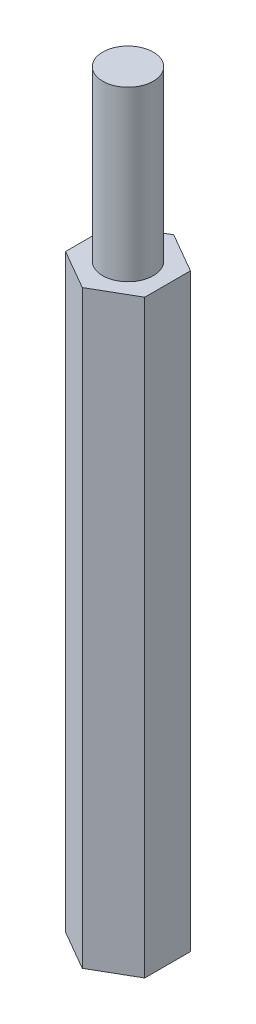
ISO-10303-21;
HEADER;
FILE_DESCRIPTION(('STEP AP214'),'2;1');
FILE_NAME('part.step','',(''),(''),'','','');
FILE_SCHEMA(('AUTOMOTIVE_DESIGN { 1 0 10303 214 1 1 1 1 }'));
ENDSEC;
DATA;
#1=APPLICATION_CONTEXT('core data for automotive mechanical design processes');
#2=APPLICATION_PROTOCOL_DEFINITION('international standard','automotive_design',2000,#1);
#3=PRODUCT_CONTEXT('',#1,'mechanical');
#4=PRODUCT('Part','Part','',(#3));
#5=PRODUCT_RELATED_PRODUCT_CATEGORY('part','',(#4));
#6=PRODUCT_DEFINITION_FORMATION('','',#4);
#7=PRODUCT_DEFINITION_CONTEXT('part definition',#1,'design');
#8=PRODUCT_DEFINITION('design','',#6,#7);
#9=PRODUCT_DEFINITION_SHAPE('','',#8);
#10=(LENGTH_UNIT() NAMED_UNIT(*) SI_UNIT(.MILLI.,.METRE.));
#11=(NAMED_UNIT(*) PLANE_ANGLE_UNIT() SI_UNIT($,.RADIAN.));
#12=(NAMED_UNIT(*) SI_UNIT($,.STERADIAN.) SOLID_ANGLE_UNIT());
#13=UNCERTAINTY_MEASURE_WITH_UNIT(LENGTH_MEASURE(1.E-05),#10,'distance_accuracy_value','');
#14=(GEOMETRIC_REPRESENTATION_CONTEXT(3) GLOBAL_UNCERTAINTY_ASSIGNED_CONTEXT((#13)) GLOBAL_UNIT_ASSIGNED_CONTEXT((#10,
#11,#12)) REPRESENTATION_CONTEXT('',''));
#15=CARTESIAN_POINT('',(0.,0.,0.));
#16=DIRECTION('',(0.,0.,1.));
#17=DIRECTION('',(1.,0.,0.));
#18=AXIS2_PLACEMENT_3D('',#15,#16,#17);
#19=CARTESIAN_POINT('',(2.34999999999999,35.,-1.35677313259565));
#20=DIRECTION('',(-0.499999999999995,0.,0.866025403784441));
#21=DIRECTION('',(0.866025403784441,0.,0.499999999999995));
#22=AXIS2_PLACEMENT_3D('',#19,#20,#21);
#23=PLANE('',#22);
#24=DIRECTION('',(-0.866025403784441,0.,-0.499999999999995));
#25=VECTOR('',#24,1.);
#26=CARTESIAN_POINT('',(2.34999999999999,0.,-1.35677313259565));
#27=LINE('',#26,#25);
#28=CARTESIAN_POINT('',(2.34999999999999,0.,-1.35677313259565));
#29=VERTEX_POINT('',#28);
#30=CARTESIAN_POINT('',(0.,0.,-2.71354626519124));
#31=VERTEX_POINT('',#30);
#32=EDGE_CURVE('E122',#29,#31,#27,.T.);
#33=ORIENTED_EDGE('',*,*,#32,.T.);
#34=DIRECTION('',(0.,-1.,0.));
#35=VECTOR('',#34,1.);
#36=CARTESIAN_POINT('',(0.,35.,-2.71354626519124));
#37=LINE('',#36,#35);
#38=CARTESIAN_POINT('',(0.,35.,-2.71354626519124));
#39=VERTEX_POINT('',#38);
#40=EDGE_CURVE('E39',#39,#31,#37,.T.);
#41=ORIENTED_EDGE('',*,*,#40,.F.);
#42=DIRECTION('',(-0.866025403784441,0.,-0.499999999999995));
#43=VECTOR('',#42,1.);
#44=CARTESIAN_POINT('',(2.34999999999999,35.,-1.35677313259565));
#45=LINE('',#44,#43);
#46=CARTESIAN_POINT('',(2.34999999999999,35.,-1.35677313259565));
#47=VERTEX_POINT('',#46);
#48=EDGE_CURVE('E133',#47,#39,#45,.T.);
#49=ORIENTED_EDGE('',*,*,#48,.F.);
#50=DIRECTION('',(0.,-1.,0.));
#51=VECTOR('',#50,1.);
#52=CARTESIAN_POINT('',(2.34999999999999,35.,-1.35677313259565));
#53=LINE('',#52,#51);
#54=EDGE_CURVE('E118',#47,#29,#53,.T.);
#55=ORIENTED_EDGE('',*,*,#54,.T.);
#56=EDGE_LOOP('',(#33,#41,#49,#55));
#57=FACE_BOUND('',#56,.T.);
#58=ADVANCED_FACE('F36',(#57),#23,.F.);
#59=CARTESIAN_POINT('',(0.,35.,-2.71354626519124));
#60=DIRECTION('',(0.500000000000001,0.,0.866025403784438));
#61=DIRECTION('',(0.866025403784438,0.,-0.500000000000001));
#62=AXIS2_PLACEMENT_3D('',#59,#60,#61);
#63=PLANE('',#62);
#64=DIRECTION('',(-0.866025403784438,0.,0.500000000000001));
#65=VECTOR('',#64,1.);
#66=CARTESIAN_POINT('',(0.,0.,-2.71354626519124));
#67=LINE('',#66,#65);
#68=CARTESIAN_POINT('',(-2.35,0.,-1.35677313259562));
#69=VERTEX_POINT('',#68);
#70=EDGE_CURVE('E125',#31,#69,#67,.T.);
#71=ORIENTED_EDGE('',*,*,#70,.T.);
#72=DIRECTION('',(0.,-1.,0.));
#73=VECTOR('',#72,1.);
#74=CARTESIAN_POINT('',(-2.35,35.,-1.35677313259562));
#75=LINE('',#74,#73);
#76=CARTESIAN_POINT('',(-2.35,35.,-1.35677313259562));
#77=VERTEX_POINT('',#76);
#78=EDGE_CURVE('E136',#77,#69,#75,.T.);
#79=ORIENTED_EDGE('',*,*,#78,.F.);
#80=DIRECTION('',(-0.866025403784438,0.,0.500000000000001));
#81=VECTOR('',#80,1.);
#82=CARTESIAN_POINT('',(0.,35.,-2.71354626519124));
#83=LINE('',#82,#81);
#84=EDGE_CURVE('E91',#39,#77,#83,.T.);
#85=ORIENTED_EDGE('',*,*,#84,.F.);
#86=ORIENTED_EDGE('',*,*,#40,.T.);
#87=EDGE_LOOP('',(#71,#79,#85,#86));
#88=FACE_BOUND('',#87,.T.);
#89=ADVANCED_FACE('F141',(#88),#63,.F.);
#90=CARTESIAN_POINT('',(-2.35,35.,-1.35677313259562));
#91=DIRECTION('',(1.,0.,0.));
#92=DIRECTION('',(0.,0.,-1.));
#93=AXIS2_PLACEMENT_3D('',#90,#91,#92);
#94=PLANE('',#93);
#95=DIRECTION('',(0.,0.,1.));
#96=VECTOR('',#95,1.);
#97=CARTESIAN_POINT('',(-2.35,0.,-1.35677313259562));
#98=LINE('',#97,#96);
#99=CARTESIAN_POINT('',(-2.35,0.,1.35677313259563));
#100=VERTEX_POINT('',#99);
#101=EDGE_CURVE('E128',#69,#100,#98,.T.);
#102=ORIENTED_EDGE('',*,*,#101,.T.);
#103=DIRECTION('',(0.,-1.,0.));
#104=VECTOR('',#103,1.);
#105=CARTESIAN_POINT('',(-2.35,35.,1.35677313259563));
#106=LINE('',#105,#104);
#107=CARTESIAN_POINT('',(-2.35,35.,1.35677313259563));
#108=VERTEX_POINT('',#107);
#109=EDGE_CURVE('E113',#108,#100,#106,.T.);
#110=ORIENTED_EDGE('',*,*,#109,.F.);
#111=DIRECTION('',(0.,0.,1.));
#112=VECTOR('',#111,1.);
#113=CARTESIAN_POINT('',(-2.35,35.,-1.35677313259562));
#114=LINE('',#113,#112);
#115=EDGE_CURVE('E104',#77,#108,#114,.T.);
#116=ORIENTED_EDGE('',*,*,#115,.F.);
#117=ORIENTED_EDGE('',*,*,#78,.T.);
#118=EDGE_LOOP('',(#102,#110,#116,#117));
#119=FACE_BOUND('',#118,.T.);
#120=ADVANCED_FACE('F147',(#119),#94,.F.);
#121=CARTESIAN_POINT('',(-2.35,35.,1.35677313259563));
#122=DIRECTION('',(0.499999999999995,0.,-0.866025403784442));
#123=DIRECTION('',(-0.866025403784442,0.,-0.499999999999995));
#124=AXIS2_PLACEMENT_3D('',#121,#122,#123);
#125=PLANE('',#124);
#126=DIRECTION('',(0.866025403784442,0.,0.499999999999995));
#127=VECTOR('',#126,1.);
#128=CARTESIAN_POINT('',(-2.35,0.,1.35677313259563));
#129=LINE('',#128,#127);
#130=CARTESIAN_POINT('',(0.,0.,2.71354626519124));
#131=VERTEX_POINT('',#130);
#132=EDGE_CURVE('E112',#100,#131,#129,.T.);
#133=ORIENTED_EDGE('',*,*,#132,.T.);
#134=DIRECTION('',(0.,-1.,0.));
#135=VECTOR('',#134,1.);
#136=CARTESIAN_POINT('',(0.,35.,2.71354626519124));
#137=LINE('',#136,#135);
#138=CARTESIAN_POINT('',(0.,35.,2.71354626519124));
#139=VERTEX_POINT('',#138);
#140=EDGE_CURVE('E109',#139,#131,#137,.T.);
#141=ORIENTED_EDGE('',*,*,#140,.F.);
#142=DIRECTION('',(0.866025403784442,0.,0.499999999999995));
#143=VECTOR('',#142,1.);
#144=CARTESIAN_POINT('',(-2.35,35.,1.35677313259563));
#145=LINE('',#144,#143);
#146=EDGE_CURVE('E98',#108,#139,#145,.T.);
#147=ORIENTED_EDGE('',*,*,#146,.F.);
#148=ORIENTED_EDGE('',*,*,#109,.T.);
#149=EDGE_LOOP('',(#133,#141,#147,#148));
#150=FACE_BOUND('',#149,.T.);
#151=ADVANCED_FACE('F110',(#150),#125,.F.);
#152=CARTESIAN_POINT('',(0.,35.,2.71354626519124));
#153=DIRECTION('',(-0.500000000000007,0.,-0.866025403784434));
#154=DIRECTION('',(-0.866025403784435,0.,0.500000000000007));
#155=AXIS2_PLACEMENT_3D('',#152,#153,#154);
#156=PLANE('',#155);
#157=DIRECTION('',(0.866025403784435,0.,-0.500000000000007));
#158=VECTOR('',#157,1.);
#159=CARTESIAN_POINT('',(0.,0.,2.71354626519124));
#160=LINE('',#159,#158);
#161=CARTESIAN_POINT('',(2.35000000000001,0.,1.3567731325956));
#162=VERTEX_POINT('',#161);
#163=EDGE_CURVE('E76',#131,#162,#160,.T.);
#164=ORIENTED_EDGE('',*,*,#163,.T.);
#165=DIRECTION('',(0.,-1.,0.));
#166=VECTOR('',#165,1.);
#167=CARTESIAN_POINT('',(2.35000000000001,35.,1.3567731325956));
#168=LINE('',#167,#166);
#169=CARTESIAN_POINT('',(2.35000000000001,35.,1.3567731325956));
#170=VERTEX_POINT('',#169);
#171=EDGE_CURVE('E114',#170,#162,#168,.T.);
#172=ORIENTED_EDGE('',*,*,#171,.F.);
#173=DIRECTION('',(0.866025403784435,0.,-0.500000000000007));
#174=VECTOR('',#173,1.);
#175=CARTESIAN_POINT('',(0.,35.,2.71354626519124));
#176=LINE('',#175,#174);
#177=EDGE_CURVE('E102',#139,#170,#176,.T.);
#178=ORIENTED_EDGE('',*,*,#177,.F.);
#179=ORIENTED_EDGE('',*,*,#140,.T.);
#180=EDGE_LOOP('',(#164,#172,#178,#179));
#181=FACE_BOUND('',#180,.T.);
#182=ADVANCED_FACE('F116',(#181),#156,.F.);
#183=CARTESIAN_POINT('',(2.35000000000001,35.,1.3567731325956));
#184=DIRECTION('',(-1.,0.,0.));
#185=DIRECTION('',(0.,0.,1.));
#186=AXIS2_PLACEMENT_3D('',#183,#184,#185);
#187=PLANE('',#186);
#188=DIRECTION('',(0.,0.,-1.));
#189=VECTOR('',#188,1.);
#190=CARTESIAN_POINT('',(2.35000000000001,0.,1.3567731325956));
#191=LINE('',#190,#189);
#192=EDGE_CURVE('E82',#162,#29,#191,.T.);
#193=ORIENTED_EDGE('',*,*,#192,.T.);
#194=ORIENTED_EDGE('',*,*,#54,.F.);
#195=DIRECTION('',(0.,0.,-1.));
#196=VECTOR('',#195,1.);
#197=CARTESIAN_POINT('',(2.35000000000001,35.,1.3567731325956));
#198=LINE('',#197,#196);
#199=EDGE_CURVE('E53',#170,#47,#198,.T.);
#200=ORIENTED_EDGE('',*,*,#199,.F.);
#201=ORIENTED_EDGE('',*,*,#171,.T.);
#202=EDGE_LOOP('',(#193,#194,#200,#201));
#203=FACE_BOUND('',#202,.T.);
#204=ADVANCED_FACE('F178',(#203),#187,.F.);
#205=CARTESIAN_POINT('',(0.,35.,0.));
#206=DIRECTION('',(0.,1.,0.));
#207=DIRECTION('',(0.,0.,1.));
#208=AXIS2_PLACEMENT_3D('',#205,#206,#207);
#209=PLANE('',#208);
#210=CARTESIAN_POINT('',(0.,35.,0.));
#211=DIRECTION('',(0.,1.,0.));
#212=DIRECTION('',(0.,0.,1.));
#213=AXIS2_PLACEMENT_3D('',#210,#211,#212);
#214=CIRCLE('',#213,1.5);
#215=CARTESIAN_POINT('',(0.,35.,1.5));
#216=VERTEX_POINT('',#215);
#217=EDGE_CURVE('E11',#216,#216,#214,.T.);
#218=ORIENTED_EDGE('',*,*,#217,.F.);
#219=EDGE_LOOP('',(#218));
#220=FACE_BOUND('',#219,.T.);
#221=ORIENTED_EDGE('',*,*,#48,.T.);
#222=ORIENTED_EDGE('',*,*,#84,.T.);
#223=ORIENTED_EDGE('',*,*,#115,.T.);
#224=ORIENTED_EDGE('',*,*,#146,.T.);
#225=ORIENTED_EDGE('',*,*,#177,.T.);
#226=ORIENTED_EDGE('',*,*,#199,.T.);
#227=EDGE_LOOP('',(#221,#222,#223,#224,#225,#226));
#228=FACE_BOUND('',#227,.T.);
#229=ADVANCED_FACE('F100',(#220,#228),#209,.T.);
#230=CARTESIAN_POINT('',(0.,0.,0.));
#231=DIRECTION('',(0.,1.,0.));
#232=DIRECTION('',(0.,0.,1.));
#233=AXIS2_PLACEMENT_3D('',#230,#231,#232);
#234=PLANE('',#233);
#235=CARTESIAN_POINT('',(0.,0.,0.));
#236=DIRECTION('',(0.,-1.,0.));
#237=DIRECTION('',(0.,0.,-1.));
#238=AXIS2_PLACEMENT_3D('',#235,#236,#237);
#239=CIRCLE('',#238,1.5);
#240=CARTESIAN_POINT('',(0.,0.,-1.5));
#241=VERTEX_POINT('',#240);
#242=EDGE_CURVE('E154',#241,#241,#239,.T.);
#243=ORIENTED_EDGE('',*,*,#242,.F.);
#244=EDGE_LOOP('',(#243));
#245=FACE_BOUND('',#244,.T.);
#246=ORIENTED_EDGE('',*,*,#32,.F.);
#247=ORIENTED_EDGE('',*,*,#192,.F.);
#248=ORIENTED_EDGE('',*,*,#163,.F.);
#249=ORIENTED_EDGE('',*,*,#132,.F.);
#250=ORIENTED_EDGE('',*,*,#101,.F.);
#251=ORIENTED_EDGE('',*,*,#70,.F.);
#252=EDGE_LOOP('',(#246,#247,#248,#249,#250,#251));
#253=FACE_BOUND('',#252,.T.);
#254=ADVANCED_FACE('F146',(#245,#253),#234,.F.);
#255=CARTESIAN_POINT('',(0.,45.,0.));
#256=DIRECTION('',(0.,-1.,0.));
#257=DIRECTION('',(0.,0.,-1.));
#258=AXIS2_PLACEMENT_3D('',#255,#256,#257);
#259=CYLINDRICAL_SURFACE('',#258,1.5);
#260=CARTESIAN_POINT('',(0.,45.,0.));
#261=DIRECTION('',(0.,1.,0.));
#262=DIRECTION('',(0.,0.,1.));
#263=AXIS2_PLACEMENT_3D('',#260,#261,#262);
#264=CIRCLE('',#263,1.5);
#265=CARTESIAN_POINT('',(0.,45.,1.5));
#266=VERTEX_POINT('',#265);
#267=EDGE_CURVE('E126',#266,#266,#264,.T.);
#268=ORIENTED_EDGE('',*,*,#267,.F.);
#269=EDGE_LOOP('',(#268));
#270=FACE_BOUND('',#269,.T.);
#271=ORIENTED_EDGE('',*,*,#217,.T.);
#272=EDGE_LOOP('',(#271));
#273=FACE_BOUND('',#272,.T.);
#274=ADVANCED_FACE('F170',(#270,#273),#259,.T.);
#275=CARTESIAN_POINT('',(0.,45.,0.));
#276=DIRECTION('',(0.,1.,0.));
#277=DIRECTION('',(0.,0.,1.));
#278=AXIS2_PLACEMENT_3D('',#275,#276,#277);
#279=PLANE('',#278);
#280=ORIENTED_EDGE('',*,*,#267,.T.);
#281=EDGE_LOOP('',(#280));
#282=FACE_BOUND('',#281,.T.);
#283=ADVANCED_FACE('F165',(#282),#279,.T.);
#284=CARTESIAN_POINT('',(0.,10.,0.));
#285=DIRECTION('',(0.,-1.,0.));
#286=DIRECTION('',(0.,0.,-1.));
#287=AXIS2_PLACEMENT_3D('',#284,#285,#286);
#288=CYLINDRICAL_SURFACE('',#287,1.5);
#289=CARTESIAN_POINT('',(0.,10.,0.));
#290=DIRECTION('',(0.,-1.,0.));
#291=DIRECTION('',(0.,0.,-1.));
#292=AXIS2_PLACEMENT_3D('',#289,#290,#291);
#293=CIRCLE('',#292,1.5);
#294=CARTESIAN_POINT('',(0.,10.,-1.5));
#295=VERTEX_POINT('',#294);
#296=EDGE_CURVE('E153',#295,#295,#293,.T.);
#297=ORIENTED_EDGE('',*,*,#296,.F.);
#298=EDGE_LOOP('',(#297));
#299=FACE_BOUND('',#298,.T.);
#300=ORIENTED_EDGE('',*,*,#242,.T.);
#301=EDGE_LOOP('',(#300));
#302=FACE_BOUND('',#301,.T.);
#303=ADVANCED_FACE('F162',(#299,#302),#288,.F.);
#304=CARTESIAN_POINT('',(0.,10.,0.));
#305=DIRECTION('',(0.,-1.,0.));
#306=DIRECTION('',(0.,0.,-1.));
#307=AXIS2_PLACEMENT_3D('',#304,#305,#306);
#308=PLANE('',#307);
#309=ORIENTED_EDGE('',*,*,#296,.T.);
#310=EDGE_LOOP('',(#309));
#311=FACE_BOUND('',#310,.T.);
#312=ADVANCED_FACE('F160',(#311),#308,.T.);
#313=CLOSED_SHELL('',(#58,#89,#120,#151,#182,#204,#229,#254,#274,#283,#303,#312));
#314=MANIFOLD_SOLID_BREP('B2',#313);
#315=ADVANCED_BREP_SHAPE_REPRESENTATION('',(#18,#314),#14);
#316=SHAPE_DEFINITION_REPRESENTATION(#9,#315);
ENDSEC;
END-ISO-10303-21;
